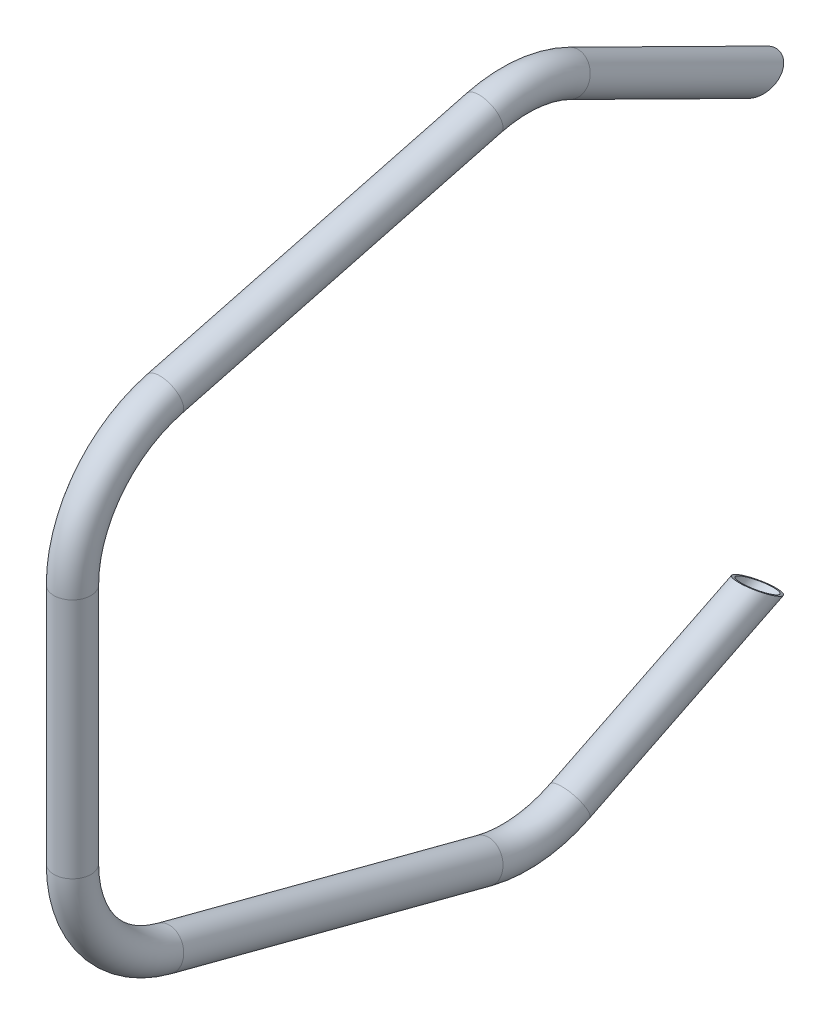
ISO-10303-21;
HEADER;
FILE_DESCRIPTION(('STEP AP214'),'2;1');
FILE_NAME('part.step','',(''),(''),'','','');
FILE_SCHEMA(('AUTOMOTIVE_DESIGN { 1 0 10303 214 1 1 1 1 }'));
ENDSEC;
DATA;
#1=APPLICATION_CONTEXT('core data for automotive mechanical design processes');
#2=APPLICATION_PROTOCOL_DEFINITION('international standard','automotive_design',2000,#1);
#3=PRODUCT_CONTEXT('',#1,'mechanical');
#4=PRODUCT('Part','Part','',(#3));
#5=PRODUCT_RELATED_PRODUCT_CATEGORY('part','',(#4));
#6=PRODUCT_DEFINITION_FORMATION('','',#4);
#7=PRODUCT_DEFINITION_CONTEXT('part definition',#1,'design');
#8=PRODUCT_DEFINITION('design','',#6,#7);
#9=PRODUCT_DEFINITION_SHAPE('','',#8);
#10=(LENGTH_UNIT() NAMED_UNIT(*) SI_UNIT(.MILLI.,.METRE.));
#11=(NAMED_UNIT(*) PLANE_ANGLE_UNIT() SI_UNIT($,.RADIAN.));
#12=(NAMED_UNIT(*) SI_UNIT($,.STERADIAN.) SOLID_ANGLE_UNIT());
#13=UNCERTAINTY_MEASURE_WITH_UNIT(LENGTH_MEASURE(1.E-05),#10,'distance_accuracy_value','');
#14=(GEOMETRIC_REPRESENTATION_CONTEXT(3) GLOBAL_UNCERTAINTY_ASSIGNED_CONTEXT((#13)) GLOBAL_UNIT_ASSIGNED_CONTEXT((#10,
#11,#12)) REPRESENTATION_CONTEXT('',''));
#15=CARTESIAN_POINT('',(0.,0.,0.));
#16=DIRECTION('',(0.,0.,1.));
#17=DIRECTION('',(1.,0.,0.));
#18=AXIS2_PLACEMENT_3D('',#15,#16,#17);
#19=CARTESIAN_POINT('',(-760.,165.589110219,196.318588142));
#20=DIRECTION('',(1.,0.,0.));
#21=DIRECTION('',(0.,0.896230961864056,-0.443587717364028));
#22=AXIS2_PLACEMENT_3D('',#19,#20,#21);
#23=TOROIDAL_SURFACE('',#22,100.,15.);
#24=CARTESIAN_POINT('',(-760.,255.212206405,151.959816406));
#25=DIRECTION('',(0.,0.443587717364028,0.896230961864056));
#26=DIRECTION('',(1.,0.,0.));
#27=AXIS2_PLACEMENT_3D('',#24,#25,#26);
#28=CIRCLE('',#27,15.);
#29=CARTESIAN_POINT('',(-760.,268.655670833459,145.306000645323));
#30=VERTEX_POINT('',#29);
#31=EDGE_CURVE('E10',#30,#30,#28,.T.);
#32=CARTESIAN_POINT('',(-760.,262.324798489,221.660383951));
#33=DIRECTION('',(0.,-0.253417958090096,0.967356882705368));
#34=DIRECTION('',(1.,0.,0.));
#35=AXIS2_PLACEMENT_3D('',#32,#33,#34);
#36=CIRCLE('',#35,15.);
#37=CARTESIAN_POINT('',(-760.,276.83515173008,225.461653322502));
#38=VERTEX_POINT('',#37);
#39=EDGE_CURVE('E24',#38,#38,#36,.T.);
#40=CARTESIAN_POINT('',(-760.,165.589110219,196.318588142));
#41=DIRECTION('',(1.,0.,0.));
#42=DIRECTION('',(0.,0.896230961864056,-0.443587717364028));
#43=AXIS2_PLACEMENT_3D('',#40,#41,#42);
#44=CIRCLE('',#43,115.);
#45=EDGE_CURVE('',#30,#38,#44,.T.);
#46=ORIENTED_EDGE('',*,*,#31,.T.);
#47=ORIENTED_EDGE('',*,*,#39,.F.);
#48=ORIENTED_EDGE('',*,*,#45,.T.);
#49=ORIENTED_EDGE('',*,*,#45,.F.);
#50=EDGE_LOOP('',(#46,#48,#47,#49));
#51=FACE_BOUND('',#50,.T.);
#52=ADVANCED_FACE('F16',(#51),#23,.T.);
#53=CARTESIAN_POINT('',(-760.,228.441483882,351.00108988));
#54=DIRECTION('',(0.,-0.253417958090096,0.967356882705368));
#55=DIRECTION('',(-1.,0.,0.));
#56=AXIS2_PLACEMENT_3D('',#53,#54,#55);
#57=CYLINDRICAL_SURFACE('',#56,15.);
#58=CARTESIAN_POINT('',(-760.,194.558169274,480.341795809));
#59=DIRECTION('',(0.,-0.253417958090096,0.967356882705368));
#60=DIRECTION('',(1.,0.,0.));
#61=AXIS2_PLACEMENT_3D('',#58,#59,#60);
#62=CIRCLE('',#61,15.);
#63=CARTESIAN_POINT('',(-760.,209.068522514988,484.143065180474));
#64=VERTEX_POINT('',#63);
#65=EDGE_CURVE('E29',#64,#64,#62,.T.);
#66=ORIENTED_EDGE('',*,*,#65,.F.);
#67=EDGE_LOOP('',(#66));
#68=FACE_BOUND('',#67,.T.);
#69=ORIENTED_EDGE('',*,*,#39,.T.);
#70=EDGE_LOOP('',(#69));
#71=FACE_BOUND('',#70,.T.);
#72=ADVANCED_FACE('F110',(#68,#71),#57,.T.);
#73=CARTESIAN_POINT('',(-760.,97.8224810039,455.));
#74=DIRECTION('',(1.,0.,0.));
#75=DIRECTION('',(0.,0.967356882705368,0.253417958090096));
#76=AXIS2_PLACEMENT_3D('',#73,#74,#75);
#77=TOROIDAL_SURFACE('',#76,100.,15.);
#78=CARTESIAN_POINT('',(-760.,97.8224810039,555.));
#79=DIRECTION('',(0.,-1.,0.));
#80=DIRECTION('',(1.,0.,0.));
#81=AXIS2_PLACEMENT_3D('',#78,#79,#80);
#82=CIRCLE('',#81,15.);
#83=CARTESIAN_POINT('',(-760.,97.8224810039,570.));
#84=VERTEX_POINT('',#83);
#85=EDGE_CURVE('E34',#84,#84,#82,.T.);
#86=CARTESIAN_POINT('',(-760.,97.8224810039,455.));
#87=DIRECTION('',(1.,0.,0.));
#88=DIRECTION('',(0.,0.967356882705368,0.253417958090096));
#89=AXIS2_PLACEMENT_3D('',#86,#87,#88);
#90=CIRCLE('',#89,115.);
#91=EDGE_CURVE('',#64,#84,#90,.T.);
#92=ORIENTED_EDGE('',*,*,#65,.T.);
#93=ORIENTED_EDGE('',*,*,#85,.F.);
#94=ORIENTED_EDGE('',*,*,#91,.T.);
#95=ORIENTED_EDGE('',*,*,#91,.F.);
#96=EDGE_LOOP('',(#92,#94,#93,#95));
#97=FACE_BOUND('',#96,.T.);
#98=ADVANCED_FACE('F115',(#97),#77,.T.);
#99=CARTESIAN_POINT('',(-760.,0.,555.));
#100=DIRECTION('',(0.,-1.,0.));
#101=DIRECTION('',(-1.,0.,0.));
#102=AXIS2_PLACEMENT_3D('',#99,#100,#101);
#103=CYLINDRICAL_SURFACE('',#102,15.);
#104=CARTESIAN_POINT('',(-760.,-97.8224810039,555.));
#105=DIRECTION('',(0.,-1.,0.));
#106=DIRECTION('',(1.,0.,0.));
#107=AXIS2_PLACEMENT_3D('',#104,#105,#106);
#108=CIRCLE('',#107,15.);
#109=CARTESIAN_POINT('',(-760.,-97.8224810039,570.));
#110=VERTEX_POINT('',#109);
#111=EDGE_CURVE('E37',#110,#110,#108,.T.);
#112=ORIENTED_EDGE('',*,*,#111,.F.);
#113=EDGE_LOOP('',(#112));
#114=FACE_BOUND('',#113,.T.);
#115=ORIENTED_EDGE('',*,*,#85,.T.);
#116=EDGE_LOOP('',(#115));
#117=FACE_BOUND('',#116,.T.);
#118=ADVANCED_FACE('F122',(#114,#117),#103,.T.);
#119=CARTESIAN_POINT('',(-760.,-97.8224810039,455.));
#120=DIRECTION('',(1.,0.,0.));
#121=DIRECTION('',(0.,0.,1.));
#122=AXIS2_PLACEMENT_3D('',#119,#120,#121);
#123=TOROIDAL_SURFACE('',#122,100.,15.);
#124=CARTESIAN_POINT('',(-760.,-194.558169274,480.341795809));
#125=DIRECTION('',(0.,-0.253417958090096,-0.967356882705368));
#126=DIRECTION('',(1.,0.,0.));
#127=AXIS2_PLACEMENT_3D('',#124,#125,#126);
#128=CIRCLE('',#127,15.);
#129=CARTESIAN_POINT('',(-760.,-209.068522514988,484.143065180474));
#130=VERTEX_POINT('',#129);
#131=EDGE_CURVE('E40',#130,#130,#128,.T.);
#132=CARTESIAN_POINT('',(-760.,-97.8224810039,455.));
#133=DIRECTION('',(1.,0.,0.));
#134=DIRECTION('',(0.,0.,1.));
#135=AXIS2_PLACEMENT_3D('',#132,#133,#134);
#136=CIRCLE('',#135,115.);
#137=EDGE_CURVE('',#110,#130,#136,.T.);
#138=ORIENTED_EDGE('',*,*,#111,.T.);
#139=ORIENTED_EDGE('',*,*,#131,.F.);
#140=ORIENTED_EDGE('',*,*,#137,.T.);
#141=ORIENTED_EDGE('',*,*,#137,.F.);
#142=EDGE_LOOP('',(#138,#140,#139,#141));
#143=FACE_BOUND('',#142,.T.);
#144=ADVANCED_FACE('F126',(#143),#123,.T.);
#145=CARTESIAN_POINT('',(-760.,-228.441483882,351.00108988));
#146=DIRECTION('',(0.,-0.253417958090096,-0.967356882705368));
#147=DIRECTION('',(-1.,0.,0.));
#148=AXIS2_PLACEMENT_3D('',#145,#146,#147);
#149=CYLINDRICAL_SURFACE('',#148,15.);
#150=CARTESIAN_POINT('',(-760.,-262.324798489,221.660383951));
#151=DIRECTION('',(0.,-0.253417958090096,-0.967356882705368));
#152=DIRECTION('',(1.,0.,0.));
#153=AXIS2_PLACEMENT_3D('',#150,#151,#152);
#154=CIRCLE('',#153,15.);
#155=CARTESIAN_POINT('',(-760.,-276.83515173008,225.461653322502));
#156=VERTEX_POINT('',#155);
#157=EDGE_CURVE('E43',#156,#156,#154,.T.);
#158=ORIENTED_EDGE('',*,*,#157,.F.);
#159=EDGE_LOOP('',(#158));
#160=FACE_BOUND('',#159,.T.);
#161=ORIENTED_EDGE('',*,*,#131,.T.);
#162=EDGE_LOOP('',(#161));
#163=FACE_BOUND('',#162,.T.);
#164=ADVANCED_FACE('F130',(#160,#163),#149,.T.);
#165=CARTESIAN_POINT('',(-760.,-165.589110219,196.318588142));
#166=DIRECTION('',(1.,0.,0.));
#167=DIRECTION('',(0.,-0.967356882705368,0.253417958090096));
#168=AXIS2_PLACEMENT_3D('',#165,#166,#167);
#169=TOROIDAL_SURFACE('',#168,100.,15.);
#170=CARTESIAN_POINT('',(-760.,-255.212206405,151.959816406));
#171=DIRECTION('',(0.,0.443587717364028,-0.896230961864056));
#172=DIRECTION('',(1.,0.,0.));
#173=AXIS2_PLACEMENT_3D('',#170,#171,#172);
#174=CIRCLE('',#173,15.);
#175=CARTESIAN_POINT('',(-760.,-268.655670833459,145.306000645323));
#176=VERTEX_POINT('',#175);
#177=EDGE_CURVE('E47',#176,#176,#174,.T.);
#178=CARTESIAN_POINT('',(-760.,-165.589110219,196.318588142));
#179=DIRECTION('',(1.,0.,0.));
#180=DIRECTION('',(0.,-0.967356882705368,0.253417958090096));
#181=AXIS2_PLACEMENT_3D('',#178,#179,#180);
#182=CIRCLE('',#181,115.);
#183=EDGE_CURVE('',#156,#176,#182,.T.);
#184=ORIENTED_EDGE('',*,*,#157,.T.);
#185=ORIENTED_EDGE('',*,*,#177,.F.);
#186=ORIENTED_EDGE('',*,*,#183,.T.);
#187=ORIENTED_EDGE('',*,*,#183,.F.);
#188=EDGE_LOOP('',(#184,#186,#185,#187));
#189=FACE_BOUND('',#188,.T.);
#190=ADVANCED_FACE('F134',(#189),#169,.T.);
#191=CARTESIAN_POINT('',(-760.,165.589110219,196.318588142));
#192=DIRECTION('',(1.,0.,0.));
#193=DIRECTION('',(0.,0.896230961864056,-0.443587717364028));
#194=AXIS2_PLACEMENT_3D('',#191,#192,#193);
#195=TOROIDAL_SURFACE('',#194,100.,13.);
#196=CARTESIAN_POINT('',(-760.,255.212206405,151.959816406));
#197=DIRECTION('',(0.,0.443587717364028,0.896230961864056));
#198=DIRECTION('',(1.,0.,0.));
#199=AXIS2_PLACEMENT_3D('',#196,#197,#198);
#200=CIRCLE('',#199,13.);
#201=CARTESIAN_POINT('',(-760.,266.863208909729,146.193176080048));
#202=VERTEX_POINT('',#201);
#203=EDGE_CURVE('E55',#202,#202,#200,.T.);
#204=CARTESIAN_POINT('',(-760.,262.324798489,221.660383951));
#205=DIRECTION('',(0.,-0.253417958090096,0.967356882705368));
#206=DIRECTION('',(1.,0.,0.));
#207=AXIS2_PLACEMENT_3D('',#204,#205,#206);
#208=CIRCLE('',#207,13.);
#209=CARTESIAN_POINT('',(-760.,274.90043796467,224.954817406319));
#210=VERTEX_POINT('',#209);
#211=EDGE_CURVE('E46',#210,#210,#208,.T.);
#212=CARTESIAN_POINT('',(-760.,165.589110219,196.318588142));
#213=DIRECTION('',(1.,0.,0.));
#214=DIRECTION('',(0.,0.896230961864056,-0.443587717364028));
#215=AXIS2_PLACEMENT_3D('',#212,#213,#214);
#216=CIRCLE('',#215,113.);
#217=EDGE_CURVE('',#202,#210,#216,.T.);
#218=ORIENTED_EDGE('',*,*,#203,.F.);
#219=ORIENTED_EDGE('',*,*,#211,.T.);
#220=ORIENTED_EDGE('',*,*,#217,.T.);
#221=ORIENTED_EDGE('',*,*,#217,.F.);
#222=EDGE_LOOP('',(#218,#220,#219,#221));
#223=FACE_BOUND('',#222,.T.);
#224=ADVANCED_FACE('F138',(#223),#195,.F.);
#225=CARTESIAN_POINT('',(-760.,228.441483882,351.00108988));
#226=DIRECTION('',(0.,-0.253417958090096,0.967356882705368));
#227=DIRECTION('',(-1.,0.,0.));
#228=AXIS2_PLACEMENT_3D('',#225,#226,#227);
#229=CYLINDRICAL_SURFACE('',#228,13.);
#230=CARTESIAN_POINT('',(-760.,194.558169274,480.341795809));
#231=DIRECTION('',(0.,-0.253417958090096,0.967356882705368));
#232=DIRECTION('',(1.,0.,0.));
#233=AXIS2_PLACEMENT_3D('',#230,#231,#232);
#234=CIRCLE('',#233,13.);
#235=CARTESIAN_POINT('',(-760.,207.133808749577,483.636229264292));
#236=VERTEX_POINT('',#235);
#237=EDGE_CURVE('E54',#236,#236,#234,.T.);
#238=ORIENTED_EDGE('',*,*,#237,.T.);
#239=EDGE_LOOP('',(#238));
#240=FACE_BOUND('',#239,.T.);
#241=ORIENTED_EDGE('',*,*,#211,.F.);
#242=EDGE_LOOP('',(#241));
#243=FACE_BOUND('',#242,.T.);
#244=ADVANCED_FACE('F142',(#240,#243),#229,.F.);
#245=CARTESIAN_POINT('',(-760.,97.8224810039,455.));
#246=DIRECTION('',(1.,0.,0.));
#247=DIRECTION('',(0.,0.967356882705368,0.253417958090096));
#248=AXIS2_PLACEMENT_3D('',#245,#246,#247);
#249=TOROIDAL_SURFACE('',#248,100.,13.);
#250=CARTESIAN_POINT('',(-760.,97.8224810039,555.));
#251=DIRECTION('',(0.,-1.,0.));
#252=DIRECTION('',(1.,0.,0.));
#253=AXIS2_PLACEMENT_3D('',#250,#251,#252);
#254=CIRCLE('',#253,13.);
#255=CARTESIAN_POINT('',(-760.,97.8224810039,568.));
#256=VERTEX_POINT('',#255);
#257=EDGE_CURVE('E62',#256,#256,#254,.T.);
#258=CARTESIAN_POINT('',(-760.,97.8224810039,455.));
#259=DIRECTION('',(1.,0.,0.));
#260=DIRECTION('',(0.,0.967356882705368,0.253417958090096));
#261=AXIS2_PLACEMENT_3D('',#258,#259,#260);
#262=CIRCLE('',#261,113.);
#263=EDGE_CURVE('',#236,#256,#262,.T.);
#264=ORIENTED_EDGE('',*,*,#237,.F.);
#265=ORIENTED_EDGE('',*,*,#257,.T.);
#266=ORIENTED_EDGE('',*,*,#263,.T.);
#267=ORIENTED_EDGE('',*,*,#263,.F.);
#268=EDGE_LOOP('',(#264,#266,#265,#267));
#269=FACE_BOUND('',#268,.T.);
#270=ADVANCED_FACE('F146',(#269),#249,.F.);
#271=CARTESIAN_POINT('',(-760.,0.,555.));
#272=DIRECTION('',(0.,-1.,0.));
#273=DIRECTION('',(-1.,0.,0.));
#274=AXIS2_PLACEMENT_3D('',#271,#272,#273);
#275=CYLINDRICAL_SURFACE('',#274,13.);
#276=CARTESIAN_POINT('',(-760.,-97.8224810039,555.));
#277=DIRECTION('',(0.,-1.,0.));
#278=DIRECTION('',(1.,0.,0.));
#279=AXIS2_PLACEMENT_3D('',#276,#277,#278);
#280=CIRCLE('',#279,13.);
#281=CARTESIAN_POINT('',(-760.,-97.8224810039,568.));
#282=VERTEX_POINT('',#281);
#283=EDGE_CURVE('E65',#282,#282,#280,.T.);
#284=ORIENTED_EDGE('',*,*,#283,.T.);
#285=EDGE_LOOP('',(#284));
#286=FACE_BOUND('',#285,.T.);
#287=ORIENTED_EDGE('',*,*,#257,.F.);
#288=EDGE_LOOP('',(#287));
#289=FACE_BOUND('',#288,.T.);
#290=ADVANCED_FACE('F150',(#286,#289),#275,.F.);
#291=CARTESIAN_POINT('',(-760.,-97.8224810039,455.));
#292=DIRECTION('',(1.,0.,0.));
#293=DIRECTION('',(0.,0.,1.));
#294=AXIS2_PLACEMENT_3D('',#291,#292,#293);
#295=TOROIDAL_SURFACE('',#294,100.,13.);
#296=CARTESIAN_POINT('',(-760.,-194.558169274,480.341795809));
#297=DIRECTION('',(0.,-0.253417958090096,-0.967356882705368));
#298=DIRECTION('',(1.,0.,0.));
#299=AXIS2_PLACEMENT_3D('',#296,#297,#298);
#300=CIRCLE('',#299,13.);
#301=CARTESIAN_POINT('',(-760.,-207.133808749577,483.636229264292));
#302=VERTEX_POINT('',#301);
#303=EDGE_CURVE('E68',#302,#302,#300,.T.);
#304=CARTESIAN_POINT('',(-760.,-97.8224810039,455.));
#305=DIRECTION('',(1.,0.,0.));
#306=DIRECTION('',(0.,0.,1.));
#307=AXIS2_PLACEMENT_3D('',#304,#305,#306);
#308=CIRCLE('',#307,113.);
#309=EDGE_CURVE('',#282,#302,#308,.T.);
#310=ORIENTED_EDGE('',*,*,#283,.F.);
#311=ORIENTED_EDGE('',*,*,#303,.T.);
#312=ORIENTED_EDGE('',*,*,#309,.T.);
#313=ORIENTED_EDGE('',*,*,#309,.F.);
#314=EDGE_LOOP('',(#310,#312,#311,#313));
#315=FACE_BOUND('',#314,.T.);
#316=ADVANCED_FACE('F154',(#315),#295,.F.);
#317=CARTESIAN_POINT('',(-760.,-228.441483882,351.00108988));
#318=DIRECTION('',(0.,-0.253417958090096,-0.967356882705368));
#319=DIRECTION('',(-1.,0.,0.));
#320=AXIS2_PLACEMENT_3D('',#317,#318,#319);
#321=CYLINDRICAL_SURFACE('',#320,13.);
#322=CARTESIAN_POINT('',(-760.,-262.324798489,221.660383951));
#323=DIRECTION('',(0.,-0.253417958090096,-0.967356882705368));
#324=DIRECTION('',(1.,0.,0.));
#325=AXIS2_PLACEMENT_3D('',#322,#323,#324);
#326=CIRCLE('',#325,13.);
#327=CARTESIAN_POINT('',(-760.,-274.90043796467,224.954817406319));
#328=VERTEX_POINT('',#327);
#329=EDGE_CURVE('E71',#328,#328,#326,.T.);
#330=ORIENTED_EDGE('',*,*,#329,.T.);
#331=EDGE_LOOP('',(#330));
#332=FACE_BOUND('',#331,.T.);
#333=ORIENTED_EDGE('',*,*,#303,.F.);
#334=EDGE_LOOP('',(#333));
#335=FACE_BOUND('',#334,.T.);
#336=ADVANCED_FACE('F106',(#332,#335),#321,.F.);
#337=CARTESIAN_POINT('',(-760.,-165.589110219,196.318588142));
#338=DIRECTION('',(1.,0.,0.));
#339=DIRECTION('',(0.,-0.967356882705368,0.253417958090096));
#340=AXIS2_PLACEMENT_3D('',#337,#338,#339);
#341=TOROIDAL_SURFACE('',#340,100.,13.);
#342=CARTESIAN_POINT('',(-760.,-255.212206405,151.959816406));
#343=DIRECTION('',(0.,0.443587717364028,-0.896230961864056));
#344=DIRECTION('',(1.,0.,0.));
#345=AXIS2_PLACEMENT_3D('',#342,#343,#344);
#346=CIRCLE('',#345,13.);
#347=CARTESIAN_POINT('',(-760.,-266.863208909729,146.193176080048));
#348=VERTEX_POINT('',#347);
#349=EDGE_CURVE('E50',#348,#348,#346,.T.);
#350=CARTESIAN_POINT('',(-760.,-165.589110219,196.318588142));
#351=DIRECTION('',(1.,0.,0.));
#352=DIRECTION('',(0.,-0.967356882705368,0.253417958090096));
#353=AXIS2_PLACEMENT_3D('',#350,#351,#352);
#354=CIRCLE('',#353,113.);
#355=EDGE_CURVE('',#328,#348,#354,.T.);
#356=ORIENTED_EDGE('',*,*,#329,.F.);
#357=ORIENTED_EDGE('',*,*,#349,.T.);
#358=ORIENTED_EDGE('',*,*,#355,.T.);
#359=ORIENTED_EDGE('',*,*,#355,.F.);
#360=EDGE_LOOP('',(#356,#358,#357,#359));
#361=FACE_BOUND('',#360,.T.);
#362=ADVANCED_FACE('F95',(#361),#341,.F.);
#363=CARTESIAN_POINT('',(-760.,161.280526728,-37.8210912506));
#364=DIRECTION('',(0.,0.443587717364028,0.896230961864056));
#365=DIRECTION('',(-1.,0.,0.));
#366=AXIS2_PLACEMENT_3D('',#363,#364,#365);
#367=CYLINDRICAL_SURFACE('',#366,13.);
#368=ORIENTED_EDGE('',*,*,#203,.T.);
#369=EDGE_LOOP('',(#368));
#370=FACE_BOUND('',#369,.T.);
#371=CARTESIAN_POINT('',(-760.,179.999999999596,-6.29343799296578E-10));
#372=DIRECTION('',(0.,0.849584521211048,0.52745250148103));
#373=DIRECTION('',(0.,-0.527452501481029,0.849584521211047));
#374=AXIS2_PLACEMENT_3D('',#371,#372,#373);
#375=ELLIPSE('',#374,15.3015970458808,13.);
#376=CARTESIAN_POINT('',(-760.,171.929134361092,12.9999999993597));
#377=VERTEX_POINT('',#376);
#378=EDGE_CURVE('E20',#377,#377,#375,.T.);
#379=ORIENTED_EDGE('',*,*,#378,.F.);
#380=EDGE_LOOP('',(#379));
#381=FACE_BOUND('',#380,.T.);
#382=ADVANCED_FACE('F92',(#370,#381),#367,.F.);
#383=CARTESIAN_POINT('',(-760.,-217.606103203,75.979908203));
#384=DIRECTION('',(0.,0.443587717364028,-0.896230961864056));
#385=DIRECTION('',(-1.,0.,0.));
#386=AXIS2_PLACEMENT_3D('',#383,#384,#385);
#387=CYLINDRICAL_SURFACE('',#386,15.);
#388=CARTESIAN_POINT('',(-760.,-180.000000000269,-1.02404196233863E-10));
#389=DIRECTION('',(0.,0.849584521211048,-0.52745250148103));
#390=DIRECTION('',(0.,-0.527452501481029,-0.849584521211047));
#391=AXIS2_PLACEMENT_3D('',#388,#389,#390);
#392=ELLIPSE('',#391,17.6556888990932,15.);
#393=CARTESIAN_POINT('',(-760.,-189.312537275467,-15.0000000000897));
#394=VERTEX_POINT('',#393);
#395=EDGE_CURVE('E51',#394,#394,#392,.F.);
#396=ORIENTED_EDGE('',*,*,#395,.T.);
#397=EDGE_LOOP('',(#396));
#398=FACE_BOUND('',#397,.T.);
#399=ORIENTED_EDGE('',*,*,#177,.T.);
#400=EDGE_LOOP('',(#399));
#401=FACE_BOUND('',#400,.T.);
#402=ADVANCED_FACE('F94',(#398,#401),#387,.T.);
#403=CARTESIAN_POINT('',(-760.,161.280526728,-37.8210912506));
#404=DIRECTION('',(0.,0.443587717364028,0.896230961864056));
#405=DIRECTION('',(-1.,0.,0.));
#406=AXIS2_PLACEMENT_3D('',#403,#404,#405);
#407=CYLINDRICAL_SURFACE('',#406,15.);
#408=ORIENTED_EDGE('',*,*,#31,.F.);
#409=EDGE_LOOP('',(#408));
#410=FACE_BOUND('',#409,.T.);
#411=CARTESIAN_POINT('',(-760.,179.999999999596,-6.29343799296578E-10));
#412=DIRECTION('',(0.,0.849584521211048,0.52745250148103));
#413=DIRECTION('',(0.,-0.527452501481029,0.849584521211047));
#414=AXIS2_PLACEMENT_3D('',#411,#412,#413);
#415=ELLIPSE('',#414,17.6556888990932,15.);
#416=CARTESIAN_POINT('',(-760.,170.687462724399,14.999999999358));
#417=VERTEX_POINT('',#416);
#418=EDGE_CURVE('E59',#417,#417,#415,.F.);
#419=ORIENTED_EDGE('',*,*,#418,.F.);
#420=EDGE_LOOP('',(#419));
#421=FACE_BOUND('',#420,.T.);
#422=ADVANCED_FACE('F103',(#410,#421),#407,.T.);
#423=CARTESIAN_POINT('',(-760.,-217.606103203,75.979908203));
#424=DIRECTION('',(0.,0.443587717364028,-0.896230961864056));
#425=DIRECTION('',(-1.,0.,0.));
#426=AXIS2_PLACEMENT_3D('',#423,#424,#425);
#427=CYLINDRICAL_SURFACE('',#426,13.);
#428=CARTESIAN_POINT('',(-760.,-180.000000000269,-1.02404196233863E-10));
#429=DIRECTION('',(0.,0.849584521211048,-0.52745250148103));
#430=DIRECTION('',(0.,-0.527452501481029,-0.849584521211047));
#431=AXIS2_PLACEMENT_3D('',#428,#429,#430);
#432=ELLIPSE('',#431,15.3015970458808,13.);
#433=CARTESIAN_POINT('',(-760.,-188.070865638774,-13.0000000000914));
#434=VERTEX_POINT('',#433);
#435=EDGE_CURVE('E58',#434,#434,#432,.T.);
#436=ORIENTED_EDGE('',*,*,#435,.T.);
#437=EDGE_LOOP('',(#436));
#438=FACE_BOUND('',#437,.T.);
#439=ORIENTED_EDGE('',*,*,#349,.F.);
#440=EDGE_LOOP('',(#439));
#441=FACE_BOUND('',#440,.T.);
#442=ADVANCED_FACE('F215',(#438,#441),#427,.F.);
#443=CARTESIAN_POINT('',(0.,170.687462724,15.));
#444=DIRECTION('',(0.,0.849584521211048,0.52745250148103));
#445=DIRECTION('',(0.,0.52745250148103,-0.849584521211047));
#446=AXIS2_PLACEMENT_3D('',#443,#444,#445);
#447=PLANE('',#446);
#448=ORIENTED_EDGE('',*,*,#418,.T.);
#449=EDGE_LOOP('',(#448));
#450=FACE_BOUND('',#449,.T.);
#451=ORIENTED_EDGE('',*,*,#378,.T.);
#452=EDGE_LOOP('',(#451));
#453=FACE_BOUND('',#452,.T.);
#454=ADVANCED_FACE('F90',(#450,#453),#447,.F.);
#455=CARTESIAN_POINT('',(0.,-170.687462725,15.));
#456=DIRECTION('',(0.,0.849584521211048,-0.52745250148103));
#457=DIRECTION('',(0.,-0.52745250148103,-0.849584521211047));
#458=AXIS2_PLACEMENT_3D('',#455,#456,#457);
#459=PLANE('',#458);
#460=ORIENTED_EDGE('',*,*,#395,.F.);
#461=EDGE_LOOP('',(#460));
#462=FACE_BOUND('',#461,.T.);
#463=ORIENTED_EDGE('',*,*,#435,.F.);
#464=EDGE_LOOP('',(#463));
#465=FACE_BOUND('',#464,.T.);
#466=ADVANCED_FACE('F18',(#462,#465),#459,.T.);
#467=CLOSED_SHELL('',(#52,#72,#98,#118,#144,#164,#190,#224,#244,#270,#290,#316,#336,#362,#382,
#402,#422,#442,#454,#466));
#468=MANIFOLD_SOLID_BREP('B1',#467);
#469=ADVANCED_BREP_SHAPE_REPRESENTATION('',(#18,#468),#14);
#470=SHAPE_DEFINITION_REPRESENTATION(#9,#469);
ENDSEC;
END-ISO-10303-21;
